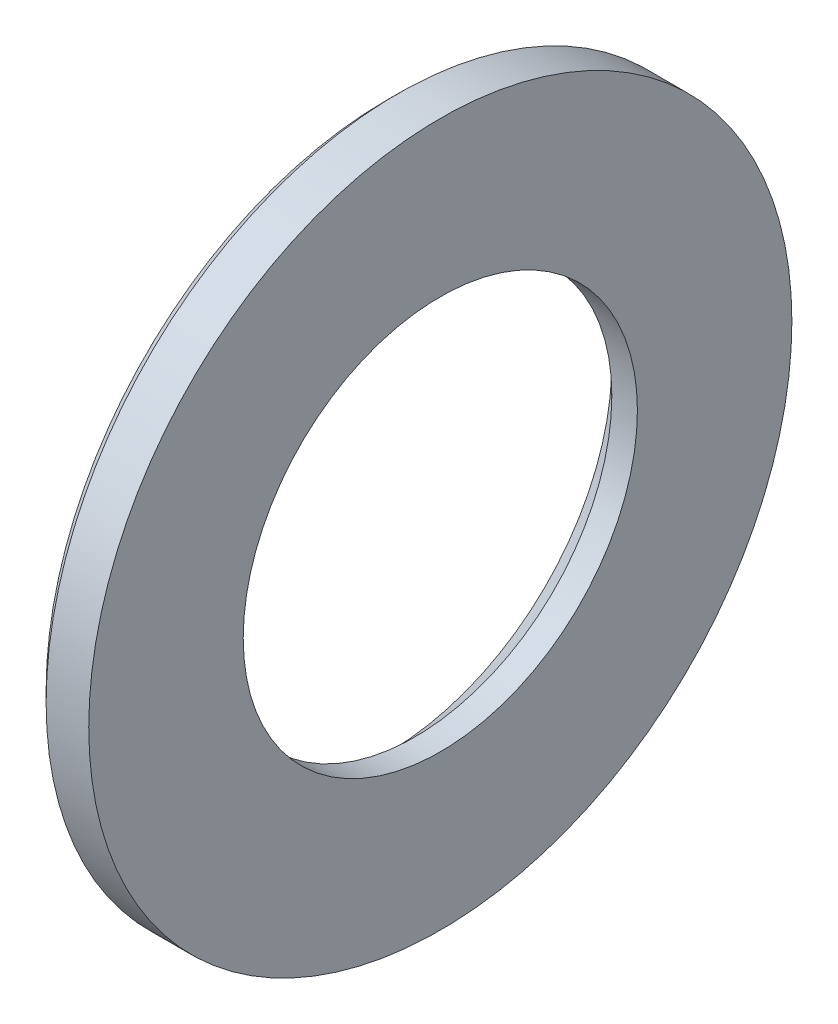
ISO-10303-21;
HEADER;
FILE_DESCRIPTION(('STEP AP214'),'2;1');
FILE_NAME('part.step','',(''),(''),'','','');
FILE_SCHEMA(('AUTOMOTIVE_DESIGN { 1 0 10303 214 1 1 1 1 }'));
ENDSEC;
DATA;
#1=APPLICATION_CONTEXT('core data for automotive mechanical design processes');
#2=APPLICATION_PROTOCOL_DEFINITION('international standard','automotive_design',2000,#1);
#3=PRODUCT_CONTEXT('',#1,'mechanical');
#4=PRODUCT('Part','Part','',(#3));
#5=PRODUCT_RELATED_PRODUCT_CATEGORY('part','',(#4));
#6=PRODUCT_DEFINITION_FORMATION('','',#4);
#7=PRODUCT_DEFINITION_CONTEXT('part definition',#1,'design');
#8=PRODUCT_DEFINITION('design','',#6,#7);
#9=PRODUCT_DEFINITION_SHAPE('','',#8);
#10=(LENGTH_UNIT() NAMED_UNIT(*) SI_UNIT(.MILLI.,.METRE.));
#11=(NAMED_UNIT(*) PLANE_ANGLE_UNIT() SI_UNIT($,.RADIAN.));
#12=(NAMED_UNIT(*) SI_UNIT($,.STERADIAN.) SOLID_ANGLE_UNIT());
#13=UNCERTAINTY_MEASURE_WITH_UNIT(LENGTH_MEASURE(1.E-05),#10,'distance_accuracy_value','');
#14=(GEOMETRIC_REPRESENTATION_CONTEXT(3) GLOBAL_UNCERTAINTY_ASSIGNED_CONTEXT((#13)) GLOBAL_UNIT_ASSIGNED_CONTEXT((#10,
#11,#12)) REPRESENTATION_CONTEXT('',''));
#15=CARTESIAN_POINT('',(0.,0.,0.));
#16=DIRECTION('',(0.,0.,1.));
#17=DIRECTION('',(1.,0.,0.));
#18=AXIS2_PLACEMENT_3D('',#15,#16,#17);
#19=CARTESIAN_POINT('',(-34.9249999999999,0.,0.));
#20=DIRECTION('',(-1.,0.,0.));
#21=DIRECTION('',(0.,0.,1.));
#22=AXIS2_PLACEMENT_3D('',#19,#20,#21);
#23=CYLINDRICAL_SURFACE('',#22,18.5);
#24=CARTESIAN_POINT('',(0.,0.,0.));
#25=DIRECTION('',(-1.,0.,0.));
#26=DIRECTION('',(0.,0.,1.));
#27=AXIS2_PLACEMENT_3D('',#24,#25,#26);
#28=CIRCLE('',#27,18.5);
#29=CARTESIAN_POINT('',(0.,0.,18.5));
#30=VERTEX_POINT('',#29);
#31=EDGE_CURVE('E10',#30,#30,#28,.T.);
#32=ORIENTED_EDGE('',*,*,#31,.F.);
#33=EDGE_LOOP('',(#32));
#34=FACE_BOUND('',#33,.T.);
#35=CARTESIAN_POINT('',(-2.4,0.,0.));
#36=DIRECTION('',(-1.,0.,0.));
#37=DIRECTION('',(0.,0.,1.));
#38=AXIS2_PLACEMENT_3D('',#35,#36,#37);
#39=CIRCLE('',#38,18.5);
#40=CARTESIAN_POINT('',(-2.4,0.,18.5));
#41=VERTEX_POINT('',#40);
#42=EDGE_CURVE('E52',#41,#41,#39,.T.);
#43=ORIENTED_EDGE('',*,*,#42,.T.);
#44=EDGE_LOOP('',(#43));
#45=FACE_BOUND('',#44,.T.);
#46=ADVANCED_FACE('F30',(#34,#45),#23,.F.);
#47=CARTESIAN_POINT('',(0.,18.5,0.));
#48=DIRECTION('',(-1.,0.,0.));
#49=DIRECTION('',(0.,0.,1.));
#50=AXIS2_PLACEMENT_3D('',#47,#48,#49);
#51=PLANE('',#50);
#52=CARTESIAN_POINT('',(0.,0.,0.));
#53=DIRECTION('',(-1.,0.,0.));
#54=DIRECTION('',(0.,0.,1.));
#55=AXIS2_PLACEMENT_3D('',#52,#53,#54);
#56=CIRCLE('',#55,33.);
#57=CARTESIAN_POINT('',(0.,0.,33.));
#58=VERTEX_POINT('',#57);
#59=EDGE_CURVE('E36',#58,#58,#56,.T.);
#60=ORIENTED_EDGE('',*,*,#59,.F.);
#61=EDGE_LOOP('',(#60));
#62=FACE_BOUND('',#61,.T.);
#63=ORIENTED_EDGE('',*,*,#31,.T.);
#64=EDGE_LOOP('',(#63));
#65=FACE_BOUND('',#64,.T.);
#66=ADVANCED_FACE('F69',(#62,#65),#51,.F.);
#67=CARTESIAN_POINT('',(-34.9249999999999,0.,0.));
#68=DIRECTION('',(-1.,0.,0.));
#69=DIRECTION('',(0.,0.,1.));
#70=AXIS2_PLACEMENT_3D('',#67,#68,#69);
#71=CYLINDRICAL_SURFACE('',#70,33.);
#72=CARTESIAN_POINT('',(-4.,0.,0.));
#73=DIRECTION('',(-1.,0.,0.));
#74=DIRECTION('',(0.,0.,1.));
#75=AXIS2_PLACEMENT_3D('',#72,#73,#74);
#76=CIRCLE('',#75,33.);
#77=CARTESIAN_POINT('',(-4.,0.,33.));
#78=VERTEX_POINT('',#77);
#79=EDGE_CURVE('E40',#78,#78,#76,.T.);
#80=ORIENTED_EDGE('',*,*,#79,.F.);
#81=EDGE_LOOP('',(#80));
#82=FACE_BOUND('',#81,.T.);
#83=ORIENTED_EDGE('',*,*,#59,.T.);
#84=EDGE_LOOP('',(#83));
#85=FACE_BOUND('',#84,.T.);
#86=ADVANCED_FACE('F74',(#82,#85),#71,.T.);
#87=CARTESIAN_POINT('',(-5.,0.,0.));
#88=DIRECTION('',(1.,0.,0.));
#89=DIRECTION('',(0.,0.,-1.));
#90=AXIS2_PLACEMENT_3D('',#87,#88,#89);
#91=CONICAL_SURFACE('',#90,32.,0.785398163397455);
#92=ORIENTED_EDGE('',*,*,#79,.T.);
#93=EDGE_LOOP('',(#92));
#94=FACE_BOUND('',#93,.T.);
#95=CARTESIAN_POINT('',(-5.,0.,0.));
#96=DIRECTION('',(-1.,0.,0.));
#97=DIRECTION('',(0.,0.,1.));
#98=AXIS2_PLACEMENT_3D('',#95,#96,#97);
#99=CIRCLE('',#98,32.);
#100=CARTESIAN_POINT('',(-5.,0.,32.));
#101=VERTEX_POINT('',#100);
#102=EDGE_CURVE('E44',#101,#101,#99,.T.);
#103=ORIENTED_EDGE('',*,*,#102,.F.);
#104=EDGE_LOOP('',(#103));
#105=FACE_BOUND('',#104,.T.);
#106=ADVANCED_FACE('F65',(#94,#105),#91,.T.);
#107=CARTESIAN_POINT('',(-5.,32.,0.));
#108=DIRECTION('',(1.,0.,0.));
#109=DIRECTION('',(0.,0.,-1.));
#110=AXIS2_PLACEMENT_3D('',#107,#108,#109);
#111=PLANE('',#110);
#112=CARTESIAN_POINT('',(-5.,0.,0.));
#113=DIRECTION('',(-1.,0.,0.));
#114=DIRECTION('',(0.,0.,1.));
#115=AXIS2_PLACEMENT_3D('',#112,#113,#114);
#116=CIRCLE('',#115,21.1);
#117=CARTESIAN_POINT('',(-5.,0.,21.1));
#118=VERTEX_POINT('',#117);
#119=EDGE_CURVE('E49',#118,#118,#116,.T.);
#120=ORIENTED_EDGE('',*,*,#119,.F.);
#121=EDGE_LOOP('',(#120));
#122=FACE_BOUND('',#121,.T.);
#123=ORIENTED_EDGE('',*,*,#102,.T.);
#124=EDGE_LOOP('',(#123));
#125=FACE_BOUND('',#124,.T.);
#126=ADVANCED_FACE('F59',(#122,#125),#111,.F.);
#127=CARTESIAN_POINT('',(-2.4,0.,0.));
#128=DIRECTION('',(-1.,0.,0.));
#129=DIRECTION('',(0.,0.,1.));
#130=AXIS2_PLACEMENT_3D('',#127,#128,#129);
#131=CONICAL_SURFACE('',#130,18.5,0.785398163397443);
#132=ORIENTED_EDGE('',*,*,#119,.T.);
#133=EDGE_LOOP('',(#132));
#134=FACE_BOUND('',#133,.T.);
#135=ORIENTED_EDGE('',*,*,#42,.F.);
#136=EDGE_LOOP('',(#135));
#137=FACE_BOUND('',#136,.T.);
#138=ADVANCED_FACE('F57',(#134,#137),#131,.F.);
#139=CLOSED_SHELL('',(#46,#66,#86,#106,#126,#138));
#140=MANIFOLD_SOLID_BREP('B2',#139);
#141=ADVANCED_BREP_SHAPE_REPRESENTATION('',(#18,#140),#14);
#142=SHAPE_DEFINITION_REPRESENTATION(#9,#141);
ENDSEC;
END-ISO-10303-21;
